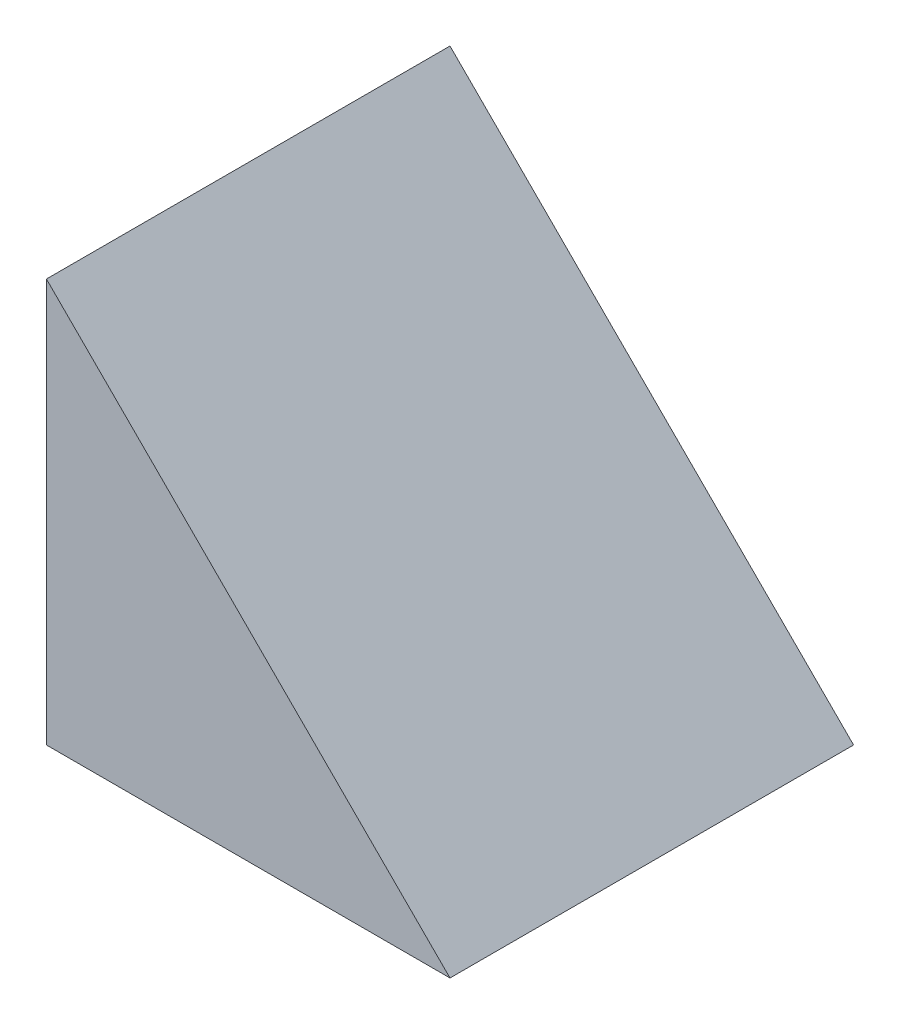
ISO-10303-21;
HEADER;
FILE_DESCRIPTION(('STEP AP214'),'2;1');
FILE_NAME('part.step','',(''),(''),'','','');
FILE_SCHEMA(('AUTOMOTIVE_DESIGN { 1 0 10303 214 1 1 1 1 }'));
ENDSEC;
DATA;
#1=APPLICATION_CONTEXT('core data for automotive mechanical design processes');
#2=APPLICATION_PROTOCOL_DEFINITION('international standard','automotive_design',2000,#1);
#3=PRODUCT_CONTEXT('',#1,'mechanical');
#4=PRODUCT('Part','Part','',(#3));
#5=PRODUCT_RELATED_PRODUCT_CATEGORY('part','',(#4));
#6=PRODUCT_DEFINITION_FORMATION('','',#4);
#7=PRODUCT_DEFINITION_CONTEXT('part definition',#1,'design');
#8=PRODUCT_DEFINITION('design','',#6,#7);
#9=PRODUCT_DEFINITION_SHAPE('','',#8);
#10=(LENGTH_UNIT() NAMED_UNIT(*) SI_UNIT(.MILLI.,.METRE.));
#11=(NAMED_UNIT(*) PLANE_ANGLE_UNIT() SI_UNIT($,.RADIAN.));
#12=(NAMED_UNIT(*) SI_UNIT($,.STERADIAN.) SOLID_ANGLE_UNIT());
#13=UNCERTAINTY_MEASURE_WITH_UNIT(LENGTH_MEASURE(1.E-05),#10,'distance_accuracy_value','');
#14=(GEOMETRIC_REPRESENTATION_CONTEXT(3) GLOBAL_UNCERTAINTY_ASSIGNED_CONTEXT((#13)) GLOBAL_UNIT_ASSIGNED_CONTEXT((#10,
#11,#12)) REPRESENTATION_CONTEXT('',''));
#15=CARTESIAN_POINT('',(0.,0.,0.));
#16=DIRECTION('',(0.,0.,1.));
#17=DIRECTION('',(1.,0.,0.));
#18=AXIS2_PLACEMENT_3D('',#15,#16,#17);
#19=CARTESIAN_POINT('',(69.574391680102,-53.030303030303,50.));
#20=DIRECTION('',(-0.707106781186547,-0.707106781186547,0.));
#21=DIRECTION('',(0.707106781186548,-0.707106781186548,0.));
#22=AXIS2_PLACEMENT_3D('',#19,#20,#21);
#23=PLANE('',#22);
#24=DIRECTION('',(-0.707106781186547,0.707106781186547,0.));
#25=VECTOR('',#24,1.);
#26=CARTESIAN_POINT('',(69.574391680102,-53.030303030303,-50.));
#27=LINE('',#26,#25);
#28=CARTESIAN_POINT('',(69.574391680102,-53.030303030303,-50.));
#29=VERTEX_POINT('',#28);
#30=CARTESIAN_POINT('',(-30.425608319898,46.969696969697,-50.));
#31=VERTEX_POINT('',#30);
#32=EDGE_CURVE('E89',#29,#31,#27,.T.);
#33=ORIENTED_EDGE('',*,*,#32,.T.);
#34=DIRECTION('',(0.,0.,-1.));
#35=VECTOR('',#34,1.);
#36=CARTESIAN_POINT('',(-30.425608319898,46.969696969697,50.));
#37=LINE('',#36,#35);
#38=CARTESIAN_POINT('',(-30.425608319898,46.969696969697,50.));
#39=VERTEX_POINT('',#38);
#40=EDGE_CURVE('E11',#39,#31,#37,.T.);
#41=ORIENTED_EDGE('',*,*,#40,.F.);
#42=DIRECTION('',(-0.707106781186547,0.707106781186547,0.));
#43=VECTOR('',#42,1.);
#44=CARTESIAN_POINT('',(69.574391680102,-53.030303030303,50.));
#45=LINE('',#44,#43);
#46=CARTESIAN_POINT('',(69.574391680102,-53.030303030303,50.));
#47=VERTEX_POINT('',#46);
#48=EDGE_CURVE('E81',#47,#39,#45,.T.);
#49=ORIENTED_EDGE('',*,*,#48,.F.);
#50=DIRECTION('',(0.,0.,-1.));
#51=VECTOR('',#50,1.);
#52=CARTESIAN_POINT('',(69.574391680102,-53.030303030303,50.));
#53=LINE('',#52,#51);
#54=EDGE_CURVE('E90',#47,#29,#53,.T.);
#55=ORIENTED_EDGE('',*,*,#54,.T.);
#56=EDGE_LOOP('',(#33,#41,#49,#55));
#57=FACE_BOUND('',#56,.T.);
#58=ADVANCED_FACE('F39',(#57),#23,.F.);
#59=CARTESIAN_POINT('',(-30.425608319898,46.969696969697,50.));
#60=DIRECTION('',(1.,0.,0.));
#61=DIRECTION('',(0.,0.,-1.));
#62=AXIS2_PLACEMENT_3D('',#59,#60,#61);
#63=PLANE('',#62);
#64=DIRECTION('',(0.,-1.,0.));
#65=VECTOR('',#64,1.);
#66=CARTESIAN_POINT('',(-30.425608319898,46.969696969697,-50.));
#67=LINE('',#66,#65);
#68=CARTESIAN_POINT('',(-30.425608319898,-53.030303030303,-50.));
#69=VERTEX_POINT('',#68);
#70=EDGE_CURVE('E68',#31,#69,#67,.T.);
#71=ORIENTED_EDGE('',*,*,#70,.T.);
#72=DIRECTION('',(0.,0.,-1.));
#73=VECTOR('',#72,1.);
#74=CARTESIAN_POINT('',(-30.425608319898,-53.030303030303,50.));
#75=LINE('',#74,#73);
#76=CARTESIAN_POINT('',(-30.425608319898,-53.030303030303,50.));
#77=VERTEX_POINT('',#76);
#78=EDGE_CURVE('E48',#77,#69,#75,.T.);
#79=ORIENTED_EDGE('',*,*,#78,.F.);
#80=DIRECTION('',(0.,-1.,0.));
#81=VECTOR('',#80,1.);
#82=CARTESIAN_POINT('',(-30.425608319898,46.969696969697,50.));
#83=LINE('',#82,#81);
#84=EDGE_CURVE('E76',#39,#77,#83,.T.);
#85=ORIENTED_EDGE('',*,*,#84,.F.);
#86=ORIENTED_EDGE('',*,*,#40,.T.);
#87=EDGE_LOOP('',(#71,#79,#85,#86));
#88=FACE_BOUND('',#87,.T.);
#89=ADVANCED_FACE('F77',(#88),#63,.F.);
#90=CARTESIAN_POINT('',(-30.425608319898,-53.030303030303,50.));
#91=DIRECTION('',(0.,1.,0.));
#92=DIRECTION('',(0.,0.,1.));
#93=AXIS2_PLACEMENT_3D('',#90,#91,#92);
#94=PLANE('',#93);
#95=DIRECTION('',(1.,0.,0.));
#96=VECTOR('',#95,1.);
#97=CARTESIAN_POINT('',(-30.425608319898,-53.030303030303,-50.));
#98=LINE('',#97,#96);
#99=EDGE_CURVE('E73',#69,#29,#98,.T.);
#100=ORIENTED_EDGE('',*,*,#99,.T.);
#101=ORIENTED_EDGE('',*,*,#54,.F.);
#102=DIRECTION('',(1.,0.,0.));
#103=VECTOR('',#102,1.);
#104=CARTESIAN_POINT('',(-30.425608319898,-53.030303030303,50.));
#105=LINE('',#104,#103);
#106=EDGE_CURVE('E56',#77,#47,#105,.T.);
#107=ORIENTED_EDGE('',*,*,#106,.F.);
#108=ORIENTED_EDGE('',*,*,#78,.T.);
#109=EDGE_LOOP('',(#100,#101,#107,#108));
#110=FACE_BOUND('',#109,.T.);
#111=ADVANCED_FACE('F102',(#110),#94,.F.);
#112=CARTESIAN_POINT('',(0.,0.,50.));
#113=DIRECTION('',(0.,0.,1.));
#114=DIRECTION('',(1.,0.,0.));
#115=AXIS2_PLACEMENT_3D('',#112,#113,#114);
#116=PLANE('',#115);
#117=ORIENTED_EDGE('',*,*,#48,.T.);
#118=ORIENTED_EDGE('',*,*,#84,.T.);
#119=ORIENTED_EDGE('',*,*,#106,.T.);
#120=EDGE_LOOP('',(#117,#118,#119));
#121=FACE_BOUND('',#120,.T.);
#122=ADVANCED_FACE('F84',(#121),#116,.T.);
#123=CARTESIAN_POINT('',(0.,0.,-50.));
#124=DIRECTION('',(0.,0.,1.));
#125=DIRECTION('',(1.,0.,0.));
#126=AXIS2_PLACEMENT_3D('',#123,#124,#125);
#127=PLANE('',#126);
#128=ORIENTED_EDGE('',*,*,#32,.F.);
#129=ORIENTED_EDGE('',*,*,#99,.F.);
#130=ORIENTED_EDGE('',*,*,#70,.F.);
#131=EDGE_LOOP('',(#128,#129,#130));
#132=FACE_BOUND('',#131,.T.);
#133=ADVANCED_FACE('F103',(#132),#127,.F.);
#134=CLOSED_SHELL('',(#58,#89,#111,#122,#133));
#135=MANIFOLD_SOLID_BREP('B2',#134);
#136=ADVANCED_BREP_SHAPE_REPRESENTATION('',(#18,#135),#14);
#137=SHAPE_DEFINITION_REPRESENTATION(#9,#136);
ENDSEC;
END-ISO-10303-21;
